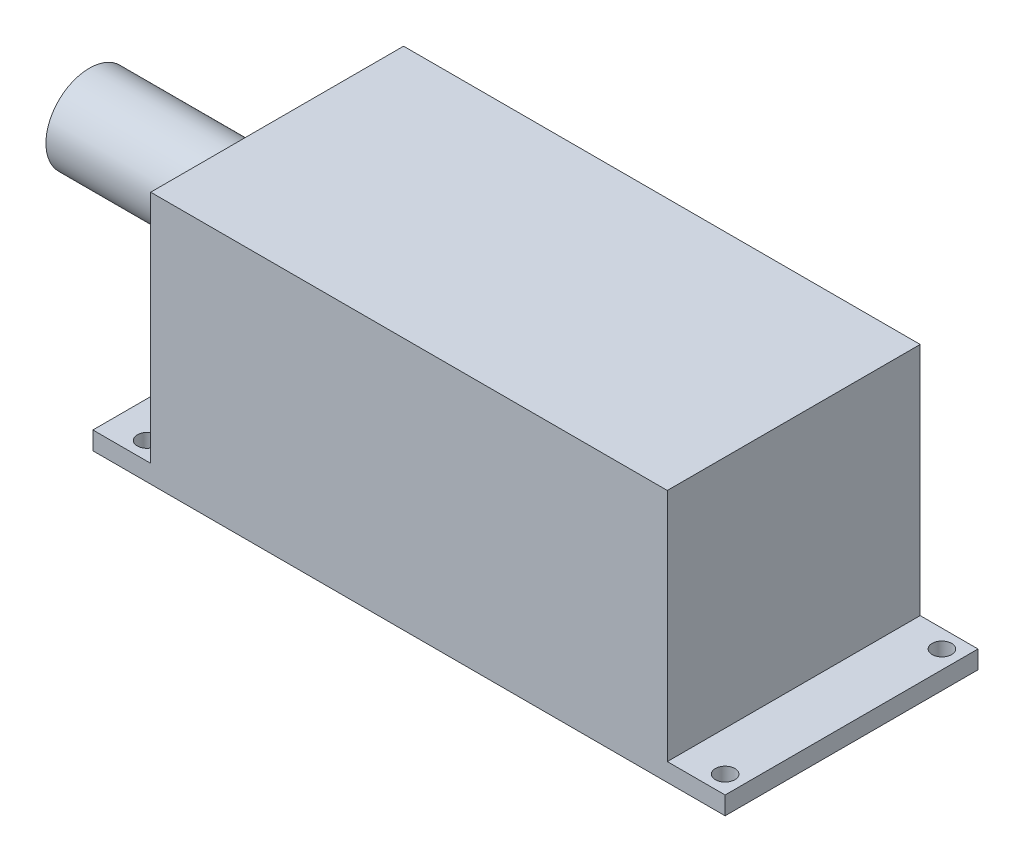
ISO-10303-21;
HEADER;
FILE_DESCRIPTION(('STEP AP214'),'2;1');
FILE_NAME('part.step','',(''),(''),'','','');
FILE_SCHEMA(('AUTOMOTIVE_DESIGN { 1 0 10303 214 1 1 1 1 }'));
ENDSEC;
DATA;
#1=APPLICATION_CONTEXT('core data for automotive mechanical design processes');
#2=APPLICATION_PROTOCOL_DEFINITION('international standard','automotive_design',2000,#1);
#3=PRODUCT_CONTEXT('',#1,'mechanical');
#4=PRODUCT('Part','Part','',(#3));
#5=PRODUCT_RELATED_PRODUCT_CATEGORY('part','',(#4));
#6=PRODUCT_DEFINITION_FORMATION('','',#4);
#7=PRODUCT_DEFINITION_CONTEXT('part definition',#1,'design');
#8=PRODUCT_DEFINITION('design','',#6,#7);
#9=PRODUCT_DEFINITION_SHAPE('','',#8);
#10=(LENGTH_UNIT() NAMED_UNIT(*) SI_UNIT(.MILLI.,.METRE.));
#11=(NAMED_UNIT(*) PLANE_ANGLE_UNIT() SI_UNIT($,.RADIAN.));
#12=(NAMED_UNIT(*) SI_UNIT($,.STERADIAN.) SOLID_ANGLE_UNIT());
#13=UNCERTAINTY_MEASURE_WITH_UNIT(LENGTH_MEASURE(1.E-05),#10,'distance_accuracy_value','');
#14=(GEOMETRIC_REPRESENTATION_CONTEXT(3) GLOBAL_UNCERTAINTY_ASSIGNED_CONTEXT((#13)) GLOBAL_UNIT_ASSIGNED_CONTEXT((#10,
#11,#12)) REPRESENTATION_CONTEXT('',''));
#15=CARTESIAN_POINT('',(0.,0.,0.));
#16=DIRECTION('',(0.,0.,1.));
#17=DIRECTION('',(1.,0.,0.));
#18=AXIS2_PLACEMENT_3D('',#15,#16,#17);
#19=CARTESIAN_POINT('',(111.125,88.9,44.45));
#20=DIRECTION('',(-1.,0.,0.));
#21=DIRECTION('',(0.,0.,1.));
#22=AXIS2_PLACEMENT_3D('',#19,#20,#21);
#23=PLANE('',#22);
#24=DIRECTION('',(0.,-1.,0.));
#25=VECTOR('',#24,1.);
#26=CARTESIAN_POINT('',(111.125,88.9,-44.45));
#27=LINE('',#26,#25);
#28=CARTESIAN_POINT('',(111.125,6.34999999999999,-44.45));
#29=VERTEX_POINT('',#28);
#30=CARTESIAN_POINT('',(111.125,0.,-44.45));
#31=VERTEX_POINT('',#30);
#32=EDGE_CURVE('E12',#29,#31,#27,.T.);
#33=ORIENTED_EDGE('',*,*,#32,.F.);
#34=DIRECTION('',(0.,0.,-1.));
#35=VECTOR('',#34,1.);
#36=CARTESIAN_POINT('',(111.125,6.34999999999999,-44.45));
#37=LINE('',#36,#35);
#38=CARTESIAN_POINT('',(111.125,6.34999999999999,44.45));
#39=VERTEX_POINT('',#38);
#40=EDGE_CURVE('E128',#39,#29,#37,.T.);
#41=ORIENTED_EDGE('',*,*,#40,.F.);
#42=DIRECTION('',(0.,-1.,0.));
#43=VECTOR('',#42,1.);
#44=CARTESIAN_POINT('',(111.125,88.9,44.45));
#45=LINE('',#44,#43);
#46=CARTESIAN_POINT('',(111.125,0.,44.45));
#47=VERTEX_POINT('',#46);
#48=EDGE_CURVE('E143',#39,#47,#45,.T.);
#49=ORIENTED_EDGE('',*,*,#48,.T.);
#50=DIRECTION('',(0.,0.,-1.));
#51=VECTOR('',#50,1.);
#52=CARTESIAN_POINT('',(111.125,0.,44.45));
#53=LINE('',#52,#51);
#54=EDGE_CURVE('E144',#47,#31,#53,.T.);
#55=ORIENTED_EDGE('',*,*,#54,.T.);
#56=EDGE_LOOP('',(#33,#41,#49,#55));
#57=FACE_BOUND('',#56,.T.);
#58=ADVANCED_FACE('F36',(#57),#23,.F.);
#59=CARTESIAN_POINT('',(-111.125,88.9,-44.45));
#60=DIRECTION('',(0.,0.,1.));
#61=DIRECTION('',(1.,0.,0.));
#62=AXIS2_PLACEMENT_3D('',#59,#60,#61);
#63=PLANE('',#62);
#64=DIRECTION('',(0.,-1.,0.));
#65=VECTOR('',#64,1.);
#66=CARTESIAN_POINT('',(-111.125,88.9,-44.45));
#67=LINE('',#66,#65);
#68=CARTESIAN_POINT('',(-111.125,6.34999999999999,-44.45));
#69=VERTEX_POINT('',#68);
#70=CARTESIAN_POINT('',(-111.125,0.,-44.45));
#71=VERTEX_POINT('',#70);
#72=EDGE_CURVE('E44',#69,#71,#67,.T.);
#73=ORIENTED_EDGE('',*,*,#72,.F.);
#74=DIRECTION('',(-1.,0.,0.));
#75=VECTOR('',#74,1.);
#76=CARTESIAN_POINT('',(-111.125,6.34999999999999,-44.45));
#77=LINE('',#76,#75);
#78=CARTESIAN_POINT('',(-90.805,6.34999999999999,-44.45));
#79=VERTEX_POINT('',#78);
#80=EDGE_CURVE('E302',#79,#69,#77,.T.);
#81=ORIENTED_EDGE('',*,*,#80,.F.);
#82=DIRECTION('',(0.,1.,0.));
#83=VECTOR('',#82,1.);
#84=CARTESIAN_POINT('',(-90.805,-91.1927212007625,-44.45));
#85=LINE('',#84,#83);
#86=CARTESIAN_POINT('',(-90.805,88.9,-44.45));
#87=VERTEX_POINT('',#86);
#88=EDGE_CURVE('E102',#79,#87,#85,.T.);
#89=ORIENTED_EDGE('',*,*,#88,.T.);
#90=DIRECTION('',(-1.,0.,0.));
#91=VECTOR('',#90,1.);
#92=CARTESIAN_POINT('',(-111.125,88.9,-44.45));
#93=LINE('',#92,#91);
#94=CARTESIAN_POINT('',(90.805,88.9,-44.45));
#95=VERTEX_POINT('',#94);
#96=EDGE_CURVE('E138',#95,#87,#93,.T.);
#97=ORIENTED_EDGE('',*,*,#96,.F.);
#98=DIRECTION('',(0.,1.,0.));
#99=VECTOR('',#98,1.);
#100=CARTESIAN_POINT('',(90.805,-91.1927212007625,-44.45));
#101=LINE('',#100,#99);
#102=CARTESIAN_POINT('',(90.805,6.34999999999999,-44.45));
#103=VERTEX_POINT('',#102);
#104=EDGE_CURVE('E59',#103,#95,#101,.T.);
#105=ORIENTED_EDGE('',*,*,#104,.F.);
#106=DIRECTION('',(-1.,0.,0.));
#107=VECTOR('',#106,1.);
#108=CARTESIAN_POINT('',(111.125,6.34999999999999,-44.45));
#109=LINE('',#108,#107);
#110=EDGE_CURVE('E125',#29,#103,#109,.T.);
#111=ORIENTED_EDGE('',*,*,#110,.F.);
#112=ORIENTED_EDGE('',*,*,#32,.T.);
#113=DIRECTION('',(-1.,0.,0.));
#114=VECTOR('',#113,1.);
#115=CARTESIAN_POINT('',(-111.125,0.,-44.45));
#116=LINE('',#115,#114);
#117=EDGE_CURVE('E147',#31,#71,#116,.T.);
#118=ORIENTED_EDGE('',*,*,#117,.T.);
#119=EDGE_LOOP('',(#73,#81,#89,#97,#105,#111,#112,#118));
#120=FACE_BOUND('',#119,.T.);
#121=ADVANCED_FACE('F165',(#120),#63,.F.);
#122=CARTESIAN_POINT('',(-111.125,88.9,44.45));
#123=DIRECTION('',(1.,0.,0.));
#124=DIRECTION('',(0.,0.,-1.));
#125=AXIS2_PLACEMENT_3D('',#122,#123,#124);
#126=PLANE('',#125);
#127=DIRECTION('',(0.,-1.,0.));
#128=VECTOR('',#127,1.);
#129=CARTESIAN_POINT('',(-111.125,88.9,44.45));
#130=LINE('',#129,#128);
#131=CARTESIAN_POINT('',(-111.125,6.34999999999999,44.45));
#132=VERTEX_POINT('',#131);
#133=CARTESIAN_POINT('',(-111.125,0.,44.45));
#134=VERTEX_POINT('',#133);
#135=EDGE_CURVE('E156',#132,#134,#130,.T.);
#136=ORIENTED_EDGE('',*,*,#135,.F.);
#137=DIRECTION('',(0.,0.,1.));
#138=VECTOR('',#137,1.);
#139=CARTESIAN_POINT('',(-111.125,6.34999999999999,-44.45));
#140=LINE('',#139,#138);
#141=EDGE_CURVE('E110',#69,#132,#140,.T.);
#142=ORIENTED_EDGE('',*,*,#141,.F.);
#143=ORIENTED_EDGE('',*,*,#72,.T.);
#144=DIRECTION('',(0.,0.,1.));
#145=VECTOR('',#144,1.);
#146=CARTESIAN_POINT('',(-111.125,0.,44.45));
#147=LINE('',#146,#145);
#148=EDGE_CURVE('E150',#71,#134,#147,.T.);
#149=ORIENTED_EDGE('',*,*,#148,.T.);
#150=EDGE_LOOP('',(#136,#142,#143,#149));
#151=FACE_BOUND('',#150,.T.);
#152=ADVANCED_FACE('F160',(#151),#126,.F.);
#153=CARTESIAN_POINT('',(-111.125,88.9,44.45));
#154=DIRECTION('',(0.,0.,-1.));
#155=DIRECTION('',(-1.,0.,0.));
#156=AXIS2_PLACEMENT_3D('',#153,#154,#155);
#157=PLANE('',#156);
#158=DIRECTION('',(0.,1.,0.));
#159=VECTOR('',#158,1.);
#160=CARTESIAN_POINT('',(-90.805,-91.1927212007625,44.45));
#161=LINE('',#160,#159);
#162=CARTESIAN_POINT('',(-90.805,6.34999999999999,44.45));
#163=VERTEX_POINT('',#162);
#164=CARTESIAN_POINT('',(-90.805,88.9,44.45));
#165=VERTEX_POINT('',#164);
#166=EDGE_CURVE('E51',#163,#165,#161,.T.);
#167=ORIENTED_EDGE('',*,*,#166,.F.);
#168=DIRECTION('',(1.,0.,0.));
#169=VECTOR('',#168,1.);
#170=CARTESIAN_POINT('',(-111.125,6.34999999999999,44.45));
#171=LINE('',#170,#169);
#172=EDGE_CURVE('E107',#132,#163,#171,.T.);
#173=ORIENTED_EDGE('',*,*,#172,.F.);
#174=ORIENTED_EDGE('',*,*,#135,.T.);
#175=DIRECTION('',(1.,0.,0.));
#176=VECTOR('',#175,1.);
#177=CARTESIAN_POINT('',(-111.125,0.,44.45));
#178=LINE('',#177,#176);
#179=EDGE_CURVE('E141',#134,#47,#178,.T.);
#180=ORIENTED_EDGE('',*,*,#179,.T.);
#181=ORIENTED_EDGE('',*,*,#48,.F.);
#182=DIRECTION('',(1.,0.,0.));
#183=VECTOR('',#182,1.);
#184=CARTESIAN_POINT('',(111.125,6.34999999999999,44.45));
#185=LINE('',#184,#183);
#186=CARTESIAN_POINT('',(90.805,6.34999999999999,44.45));
#187=VERTEX_POINT('',#186);
#188=EDGE_CURVE('E130',#187,#39,#185,.T.);
#189=ORIENTED_EDGE('',*,*,#188,.F.);
#190=DIRECTION('',(0.,1.,0.));
#191=VECTOR('',#190,1.);
#192=CARTESIAN_POINT('',(90.805,-91.1927212007625,44.45));
#193=LINE('',#192,#191);
#194=CARTESIAN_POINT('',(90.805,88.9,44.45));
#195=VERTEX_POINT('',#194);
#196=EDGE_CURVE('E132',#187,#195,#193,.T.);
#197=ORIENTED_EDGE('',*,*,#196,.T.);
#198=DIRECTION('',(1.,0.,0.));
#199=VECTOR('',#198,1.);
#200=CARTESIAN_POINT('',(-111.125,88.9,44.45));
#201=LINE('',#200,#199);
#202=EDGE_CURVE('E119',#165,#195,#201,.T.);
#203=ORIENTED_EDGE('',*,*,#202,.F.);
#204=EDGE_LOOP('',(#167,#173,#174,#180,#181,#189,#197,#203));
#205=FACE_BOUND('',#204,.T.);
#206=ADVANCED_FACE('F116',(#205),#157,.F.);
#207=CARTESIAN_POINT('',(0.,88.9,0.));
#208=DIRECTION('',(0.,-1.,0.));
#209=DIRECTION('',(0.,0.,-1.));
#210=AXIS2_PLACEMENT_3D('',#207,#208,#209);
#211=PLANE('',#210);
#212=ORIENTED_EDGE('',*,*,#96,.T.);
#213=DIRECTION('',(0.,0.,-1.));
#214=VECTOR('',#213,1.);
#215=CARTESIAN_POINT('',(-90.805,88.9,-44.45));
#216=LINE('',#215,#214);
#217=EDGE_CURVE('E113',#165,#87,#216,.T.);
#218=ORIENTED_EDGE('',*,*,#217,.F.);
#219=ORIENTED_EDGE('',*,*,#202,.T.);
#220=DIRECTION('',(0.,0.,1.));
#221=VECTOR('',#220,1.);
#222=CARTESIAN_POINT('',(90.805,88.9,-44.45));
#223=LINE('',#222,#221);
#224=EDGE_CURVE('E123',#95,#195,#223,.T.);
#225=ORIENTED_EDGE('',*,*,#224,.F.);
#226=EDGE_LOOP('',(#212,#218,#219,#225));
#227=FACE_BOUND('',#226,.T.);
#228=ADVANCED_FACE('F179',(#227),#211,.F.);
#229=CARTESIAN_POINT('',(0.,0.,0.));
#230=DIRECTION('',(0.,-1.,0.));
#231=DIRECTION('',(0.,0.,-1.));
#232=AXIS2_PLACEMENT_3D('',#229,#230,#231);
#233=PLANE('',#232);
#234=CARTESIAN_POINT('',(-98.4249999999992,0.,38.1));
#235=DIRECTION('',(0.,1.,0.));
#236=DIRECTION('',(0.,0.,1.));
#237=AXIS2_PLACEMENT_3D('',#234,#235,#236);
#238=CIRCLE('',#237,3.429);
#239=CARTESIAN_POINT('',(-98.4249999999992,0.,41.529));
#240=VERTEX_POINT('',#239);
#241=EDGE_CURVE('E309',#240,#240,#238,.T.);
#242=ORIENTED_EDGE('',*,*,#241,.T.);
#243=EDGE_LOOP('',(#242));
#244=FACE_BOUND('',#243,.T.);
#245=CARTESIAN_POINT('',(104.775000000001,0.,38.1));
#246=DIRECTION('',(0.,1.,0.));
#247=DIRECTION('',(0.,0.,1.));
#248=AXIS2_PLACEMENT_3D('',#245,#246,#247);
#249=CIRCLE('',#248,3.429);
#250=CARTESIAN_POINT('',(104.775000000001,0.,41.529));
#251=VERTEX_POINT('',#250);
#252=EDGE_CURVE('E315',#251,#251,#249,.T.);
#253=ORIENTED_EDGE('',*,*,#252,.T.);
#254=EDGE_LOOP('',(#253));
#255=FACE_BOUND('',#254,.T.);
#256=CARTESIAN_POINT('',(104.775,0.,-38.1));
#257=DIRECTION('',(0.,1.,0.));
#258=DIRECTION('',(0.,0.,1.));
#259=AXIS2_PLACEMENT_3D('',#256,#257,#258);
#260=CIRCLE('',#259,3.429);
#261=CARTESIAN_POINT('',(104.775,0.,-34.671));
#262=VERTEX_POINT('',#261);
#263=EDGE_CURVE('E304',#262,#262,#260,.T.);
#264=ORIENTED_EDGE('',*,*,#263,.T.);
#265=EDGE_LOOP('',(#264));
#266=FACE_BOUND('',#265,.T.);
#267=CARTESIAN_POINT('',(-98.425,0.,-38.1));
#268=DIRECTION('',(0.,1.,0.));
#269=DIRECTION('',(0.,0.,1.));
#270=AXIS2_PLACEMENT_3D('',#267,#268,#269);
#271=CIRCLE('',#270,3.429);
#272=CARTESIAN_POINT('',(-98.425,0.,-34.671));
#273=VERTEX_POINT('',#272);
#274=EDGE_CURVE('E292',#273,#273,#271,.T.);
#275=ORIENTED_EDGE('',*,*,#274,.T.);
#276=EDGE_LOOP('',(#275));
#277=FACE_BOUND('',#276,.T.);
#278=ORIENTED_EDGE('',*,*,#54,.F.);
#279=ORIENTED_EDGE('',*,*,#179,.F.);
#280=ORIENTED_EDGE('',*,*,#148,.F.);
#281=ORIENTED_EDGE('',*,*,#117,.F.);
#282=EDGE_LOOP('',(#278,#279,#280,#281));
#283=FACE_BOUND('',#282,.T.);
#284=ADVANCED_FACE('F170',(#244,#255,#266,#277,#283),#233,.T.);
#285=CARTESIAN_POINT('',(0.,6.35,0.));
#286=DIRECTION('',(0.,-1.,0.));
#287=DIRECTION('',(0.,0.,-1.));
#288=AXIS2_PLACEMENT_3D('',#285,#286,#287);
#289=PLANE('',#288);
#290=CARTESIAN_POINT('',(104.775000000001,6.35,38.1));
#291=DIRECTION('',(0.,1.,0.));
#292=DIRECTION('',(0.,0.,1.));
#293=AXIS2_PLACEMENT_3D('',#290,#291,#292);
#294=CIRCLE('',#293,3.429);
#295=CARTESIAN_POINT('',(104.775000000001,6.35,41.529));
#296=VERTEX_POINT('',#295);
#297=EDGE_CURVE('E312',#296,#296,#294,.T.);
#298=ORIENTED_EDGE('',*,*,#297,.F.);
#299=EDGE_LOOP('',(#298));
#300=FACE_BOUND('',#299,.T.);
#301=CARTESIAN_POINT('',(104.775,6.35,-38.1));
#302=DIRECTION('',(0.,1.,0.));
#303=DIRECTION('',(0.,0.,1.));
#304=AXIS2_PLACEMENT_3D('',#301,#302,#303);
#305=CIRCLE('',#304,3.429);
#306=CARTESIAN_POINT('',(104.775,6.35,-34.671));
#307=VERTEX_POINT('',#306);
#308=EDGE_CURVE('E318',#307,#307,#305,.T.);
#309=ORIENTED_EDGE('',*,*,#308,.F.);
#310=EDGE_LOOP('',(#309));
#311=FACE_BOUND('',#310,.T.);
#312=ORIENTED_EDGE('',*,*,#40,.T.);
#313=ORIENTED_EDGE('',*,*,#110,.T.);
#314=DIRECTION('',(0.,0.,1.));
#315=VECTOR('',#314,1.);
#316=CARTESIAN_POINT('',(90.805,6.34999999999999,-44.45));
#317=LINE('',#316,#315);
#318=EDGE_CURVE('E133',#103,#187,#317,.T.);
#319=ORIENTED_EDGE('',*,*,#318,.T.);
#320=ORIENTED_EDGE('',*,*,#188,.T.);
#321=EDGE_LOOP('',(#312,#313,#319,#320));
#322=FACE_BOUND('',#321,.T.);
#323=ADVANCED_FACE('F176',(#300,#311,#322),#289,.F.);
#324=CARTESIAN_POINT('',(90.805,-91.1927212007625,-44.45));
#325=DIRECTION('',(-1.,0.,0.));
#326=DIRECTION('',(0.,0.,1.));
#327=AXIS2_PLACEMENT_3D('',#324,#325,#326);
#328=PLANE('',#327);
#329=ORIENTED_EDGE('',*,*,#104,.T.);
#330=ORIENTED_EDGE('',*,*,#224,.T.);
#331=ORIENTED_EDGE('',*,*,#196,.F.);
#332=ORIENTED_EDGE('',*,*,#318,.F.);
#333=EDGE_LOOP('',(#329,#330,#331,#332));
#334=FACE_BOUND('',#333,.T.);
#335=ADVANCED_FACE('F180',(#334),#328,.F.);
#336=CARTESIAN_POINT('',(0.,6.35,0.));
#337=DIRECTION('',(0.,-1.,0.));
#338=DIRECTION('',(0.,0.,-1.));
#339=AXIS2_PLACEMENT_3D('',#336,#337,#338);
#340=PLANE('',#339);
#341=CARTESIAN_POINT('',(-98.4249999999992,6.35,38.1));
#342=DIRECTION('',(0.,1.,0.));
#343=DIRECTION('',(0.,0.,1.));
#344=AXIS2_PLACEMENT_3D('',#341,#342,#343);
#345=CIRCLE('',#344,3.429);
#346=CARTESIAN_POINT('',(-98.4249999999992,6.35,41.529));
#347=VERTEX_POINT('',#346);
#348=EDGE_CURVE('E306',#347,#347,#345,.T.);
#349=ORIENTED_EDGE('',*,*,#348,.F.);
#350=EDGE_LOOP('',(#349));
#351=FACE_BOUND('',#350,.T.);
#352=CARTESIAN_POINT('',(-98.425,6.35,-38.1));
#353=DIRECTION('',(0.,1.,0.));
#354=DIRECTION('',(0.,0.,1.));
#355=AXIS2_PLACEMENT_3D('',#352,#353,#354);
#356=CIRCLE('',#355,3.429);
#357=CARTESIAN_POINT('',(-98.425,6.35,-34.671));
#358=VERTEX_POINT('',#357);
#359=EDGE_CURVE('E296',#358,#358,#356,.T.);
#360=ORIENTED_EDGE('',*,*,#359,.F.);
#361=EDGE_LOOP('',(#360));
#362=FACE_BOUND('',#361,.T.);
#363=ORIENTED_EDGE('',*,*,#141,.T.);
#364=ORIENTED_EDGE('',*,*,#172,.T.);
#365=DIRECTION('',(0.,0.,-1.));
#366=VECTOR('',#365,1.);
#367=CARTESIAN_POINT('',(-90.805,6.34999999999999,-44.45));
#368=LINE('',#367,#366);
#369=EDGE_CURVE('E98',#163,#79,#368,.T.);
#370=ORIENTED_EDGE('',*,*,#369,.T.);
#371=ORIENTED_EDGE('',*,*,#80,.T.);
#372=EDGE_LOOP('',(#363,#364,#370,#371));
#373=FACE_BOUND('',#372,.T.);
#374=ADVANCED_FACE('F108',(#351,#362,#373),#340,.F.);
#375=CARTESIAN_POINT('',(-90.805,-91.1927212007625,-44.45));
#376=DIRECTION('',(1.,0.,0.));
#377=DIRECTION('',(0.,0.,-1.));
#378=AXIS2_PLACEMENT_3D('',#375,#376,#377);
#379=PLANE('',#378);
#380=CARTESIAN_POINT('',(-90.805,56.1594,0.));
#381=DIRECTION('',(1.,0.,0.));
#382=DIRECTION('',(0.,0.,-1.));
#383=AXIS2_PLACEMENT_3D('',#380,#381,#382);
#384=CIRCLE('',#383,15.24);
#385=CARTESIAN_POINT('',(-90.805,56.1594,-15.24));
#386=VERTEX_POINT('',#385);
#387=EDGE_CURVE('E39',#386,#386,#384,.T.);
#388=ORIENTED_EDGE('',*,*,#387,.T.);
#389=EDGE_LOOP('',(#388));
#390=FACE_BOUND('',#389,.T.);
#391=ORIENTED_EDGE('',*,*,#166,.T.);
#392=ORIENTED_EDGE('',*,*,#217,.T.);
#393=ORIENTED_EDGE('',*,*,#88,.F.);
#394=ORIENTED_EDGE('',*,*,#369,.F.);
#395=EDGE_LOOP('',(#391,#392,#393,#394));
#396=FACE_BOUND('',#395,.T.);
#397=ADVANCED_FACE('F100',(#390,#396),#379,.F.);
#398=CARTESIAN_POINT('',(0.,56.1594,0.));
#399=DIRECTION('',(1.,0.,0.));
#400=DIRECTION('',(0.,0.,-1.));
#401=AXIS2_PLACEMENT_3D('',#398,#399,#400);
#402=CYLINDRICAL_SURFACE('',#401,15.24);
#403=CARTESIAN_POINT('',(-156.845,56.1594,0.));
#404=DIRECTION('',(1.,0.,0.));
#405=DIRECTION('',(0.,0.,-1.));
#406=AXIS2_PLACEMENT_3D('',#403,#404,#405);
#407=CIRCLE('',#406,15.24);
#408=CARTESIAN_POINT('',(-156.845,56.1594,-15.24));
#409=VERTEX_POINT('',#408);
#410=EDGE_CURVE('E290',#409,#409,#407,.T.);
#411=ORIENTED_EDGE('',*,*,#410,.T.);
#412=EDGE_LOOP('',(#411));
#413=FACE_BOUND('',#412,.T.);
#414=ORIENTED_EDGE('',*,*,#387,.F.);
#415=EDGE_LOOP('',(#414));
#416=FACE_BOUND('',#415,.T.);
#417=ADVANCED_FACE('F278',(#413,#416),#402,.T.);
#418=CARTESIAN_POINT('',(-156.845,56.1594,0.));
#419=DIRECTION('',(-1.,0.,0.));
#420=DIRECTION('',(0.,0.,1.));
#421=AXIS2_PLACEMENT_3D('',#418,#419,#420);
#422=PLANE('',#421);
#423=ORIENTED_EDGE('',*,*,#410,.F.);
#424=EDGE_LOOP('',(#423));
#425=FACE_BOUND('',#424,.T.);
#426=ADVANCED_FACE('F239',(#425),#422,.T.);
#427=CARTESIAN_POINT('',(-98.425,0.,-38.1));
#428=DIRECTION('',(0.,1.,0.));
#429=DIRECTION('',(0.,0.,1.));
#430=AXIS2_PLACEMENT_3D('',#427,#428,#429);
#431=CYLINDRICAL_SURFACE('',#430,3.429);
#432=ORIENTED_EDGE('',*,*,#274,.F.);
#433=EDGE_LOOP('',(#432));
#434=FACE_BOUND('',#433,.T.);
#435=ORIENTED_EDGE('',*,*,#359,.T.);
#436=EDGE_LOOP('',(#435));
#437=FACE_BOUND('',#436,.T.);
#438=ADVANCED_FACE('F233',(#434,#437),#431,.F.);
#439=CARTESIAN_POINT('',(-98.4249999999992,0.,38.1));
#440=DIRECTION('',(0.,1.,0.));
#441=DIRECTION('',(0.,0.,1.));
#442=AXIS2_PLACEMENT_3D('',#439,#440,#441);
#443=CYLINDRICAL_SURFACE('',#442,3.429);
#444=ORIENTED_EDGE('',*,*,#241,.F.);
#445=EDGE_LOOP('',(#444));
#446=FACE_BOUND('',#445,.T.);
#447=ORIENTED_EDGE('',*,*,#348,.T.);
#448=EDGE_LOOP('',(#447));
#449=FACE_BOUND('',#448,.T.);
#450=ADVANCED_FACE('F238',(#446,#449),#443,.F.);
#451=CARTESIAN_POINT('',(104.775,0.,-38.1));
#452=DIRECTION('',(0.,1.,0.));
#453=DIRECTION('',(0.,0.,1.));
#454=AXIS2_PLACEMENT_3D('',#451,#452,#453);
#455=CYLINDRICAL_SURFACE('',#454,3.429);
#456=ORIENTED_EDGE('',*,*,#263,.F.);
#457=EDGE_LOOP('',(#456));
#458=FACE_BOUND('',#457,.T.);
#459=ORIENTED_EDGE('',*,*,#308,.T.);
#460=EDGE_LOOP('',(#459));
#461=FACE_BOUND('',#460,.T.);
#462=ADVANCED_FACE('F251',(#458,#461),#455,.F.);
#463=CARTESIAN_POINT('',(104.775000000001,0.,38.1));
#464=DIRECTION('',(0.,1.,0.));
#465=DIRECTION('',(0.,0.,1.));
#466=AXIS2_PLACEMENT_3D('',#463,#464,#465);
#467=CYLINDRICAL_SURFACE('',#466,3.429);
#468=ORIENTED_EDGE('',*,*,#252,.F.);
#469=EDGE_LOOP('',(#468));
#470=FACE_BOUND('',#469,.T.);
#471=ORIENTED_EDGE('',*,*,#297,.T.);
#472=EDGE_LOOP('',(#471));
#473=FACE_BOUND('',#472,.T.);
#474=ADVANCED_FACE('F261',(#470,#473),#467,.F.);
#475=CLOSED_SHELL('',(#58,#121,#152,#206,#228,#284,#323,#335,#374,#397,#417,#426,#438,#450,#462,#474));
#476=MANIFOLD_SOLID_BREP('B2',#475);
#477=ADVANCED_BREP_SHAPE_REPRESENTATION('',(#18,#476),#14);
#478=SHAPE_DEFINITION_REPRESENTATION(#9,#477);
ENDSEC;
END-ISO-10303-21;
